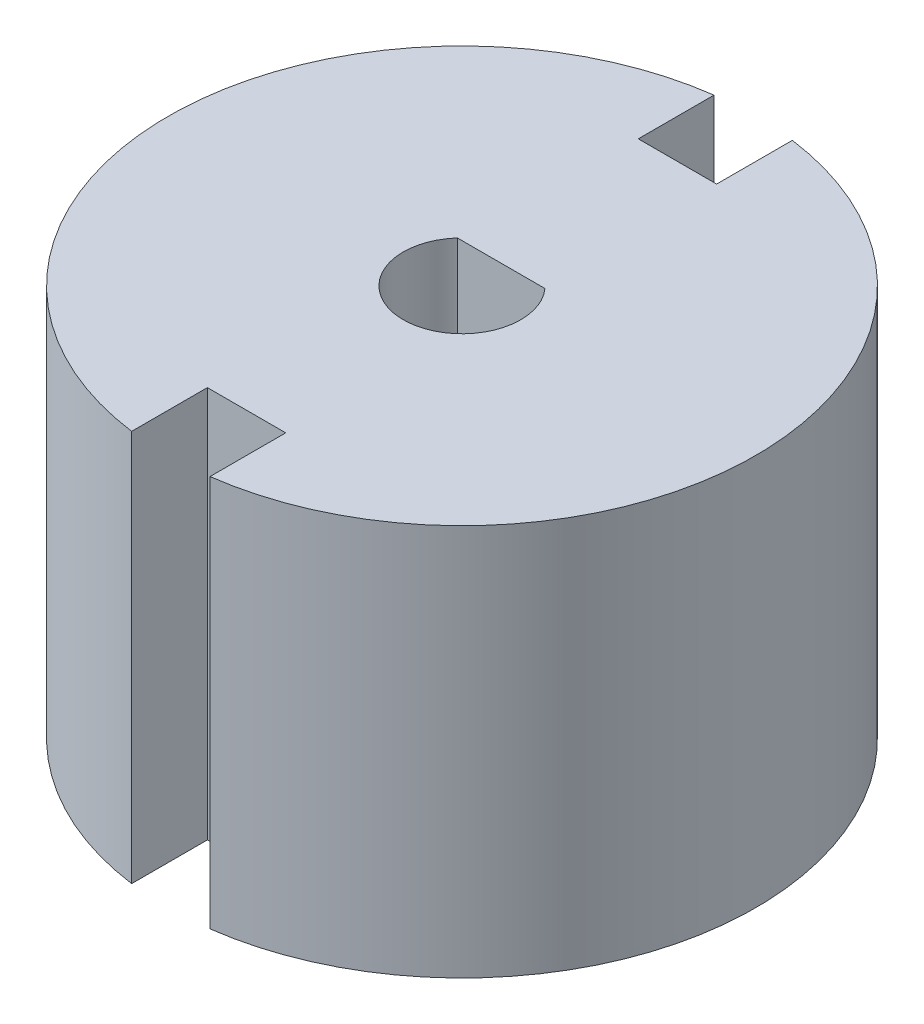
ISO-10303-21;
HEADER;
FILE_DESCRIPTION(('STEP AP214'),'2;1');
FILE_NAME('part.step','',(''),(''),'','','');
FILE_SCHEMA(('AUTOMOTIVE_DESIGN { 1 0 10303 214 1 1 1 1 }'));
ENDSEC;
DATA;
#1=APPLICATION_CONTEXT('core data for automotive mechanical design processes');
#2=APPLICATION_PROTOCOL_DEFINITION('international standard','automotive_design',2000,#1);
#3=PRODUCT_CONTEXT('',#1,'mechanical');
#4=PRODUCT('Part','Part','',(#3));
#5=PRODUCT_RELATED_PRODUCT_CATEGORY('part','',(#4));
#6=PRODUCT_DEFINITION_FORMATION('','',#4);
#7=PRODUCT_DEFINITION_CONTEXT('part definition',#1,'design');
#8=PRODUCT_DEFINITION('design','',#6,#7);
#9=PRODUCT_DEFINITION_SHAPE('','',#8);
#10=(LENGTH_UNIT() NAMED_UNIT(*) SI_UNIT(.MILLI.,.METRE.));
#11=(NAMED_UNIT(*) PLANE_ANGLE_UNIT() SI_UNIT($,.RADIAN.));
#12=(NAMED_UNIT(*) SI_UNIT($,.STERADIAN.) SOLID_ANGLE_UNIT());
#13=UNCERTAINTY_MEASURE_WITH_UNIT(LENGTH_MEASURE(1.E-05),#10,'distance_accuracy_value','');
#14=(GEOMETRIC_REPRESENTATION_CONTEXT(3) GLOBAL_UNCERTAINTY_ASSIGNED_CONTEXT((#13)) GLOBAL_UNIT_ASSIGNED_CONTEXT((#10,
#11,#12)) REPRESENTATION_CONTEXT('',''));
#15=CARTESIAN_POINT('',(0.,0.,0.));
#16=DIRECTION('',(0.,0.,1.));
#17=DIRECTION('',(1.,0.,0.));
#18=AXIS2_PLACEMENT_3D('',#15,#16,#17);
#19=CARTESIAN_POINT('',(1.,10.,0.));
#20=DIRECTION('',(1.,0.,0.));
#21=DIRECTION('',(0.,0.,-1.));
#22=AXIS2_PLACEMENT_3D('',#19,#20,#21);
#23=PLANE('',#22);
#24=DIRECTION('',(0.,0.,1.));
#25=VECTOR('',#24,1.);
#26=CARTESIAN_POINT('',(1.,0.,0.));
#27=LINE('',#26,#25);
#28=CARTESIAN_POINT('',(1.,0.,5.5));
#29=VERTEX_POINT('',#28);
#30=CARTESIAN_POINT('',(1.,0.,7.43303437365925));
#31=VERTEX_POINT('',#30);
#32=EDGE_CURVE('E154',#29,#31,#27,.T.);
#33=ORIENTED_EDGE('',*,*,#32,.T.);
#34=DIRECTION('',(0.,-1.,0.));
#35=VECTOR('',#34,1.);
#36=CARTESIAN_POINT('',(1.,10.,7.43303437365925));
#37=LINE('',#36,#35);
#38=CARTESIAN_POINT('',(1.,10.,7.43303437365925));
#39=VERTEX_POINT('',#38);
#40=EDGE_CURVE('E11',#39,#31,#37,.T.);
#41=ORIENTED_EDGE('',*,*,#40,.F.);
#42=DIRECTION('',(0.,0.,1.));
#43=VECTOR('',#42,1.);
#44=CARTESIAN_POINT('',(1.,10.,0.));
#45=LINE('',#44,#43);
#46=CARTESIAN_POINT('',(1.,10.,5.5));
#47=VERTEX_POINT('',#46);
#48=EDGE_CURVE('E229',#47,#39,#45,.T.);
#49=ORIENTED_EDGE('',*,*,#48,.F.);
#50=DIRECTION('',(0.,-1.,0.));
#51=VECTOR('',#50,1.);
#52=CARTESIAN_POINT('',(1.,10.,5.5));
#53=LINE('',#52,#51);
#54=EDGE_CURVE('E172',#47,#29,#53,.T.);
#55=ORIENTED_EDGE('',*,*,#54,.T.);
#56=EDGE_LOOP('',(#33,#41,#49,#55));
#57=FACE_BOUND('',#56,.T.);
#58=ADVANCED_FACE('F35',(#57),#23,.F.);
#59=CARTESIAN_POINT('',(0.,10.,0.));
#60=DIRECTION('',(0.,-1.,0.));
#61=DIRECTION('',(0.,0.,-1.));
#62=AXIS2_PLACEMENT_3D('',#59,#60,#61);
#63=CYLINDRICAL_SURFACE('',#62,7.5);
#64=CARTESIAN_POINT('',(0.,0.,0.));
#65=DIRECTION('',(0.,1.,0.));
#66=DIRECTION('',(0.,0.,1.));
#67=AXIS2_PLACEMENT_3D('',#64,#65,#66);
#68=CIRCLE('',#67,7.5);
#69=CARTESIAN_POINT('',(1.,0.,-7.43303437365925));
#70=VERTEX_POINT('',#69);
#71=EDGE_CURVE('E157',#31,#70,#68,.T.);
#72=ORIENTED_EDGE('',*,*,#71,.T.);
#73=DIRECTION('',(0.,-1.,0.));
#74=VECTOR('',#73,1.);
#75=CARTESIAN_POINT('',(1.,10.,-7.43303437365925));
#76=LINE('',#75,#74);
#77=CARTESIAN_POINT('',(1.,10.,-7.43303437365925));
#78=VERTEX_POINT('',#77);
#79=EDGE_CURVE('E45',#78,#70,#76,.T.);
#80=ORIENTED_EDGE('',*,*,#79,.F.);
#81=CARTESIAN_POINT('',(0.,10.,0.));
#82=DIRECTION('',(0.,1.,0.));
#83=DIRECTION('',(0.,0.,1.));
#84=AXIS2_PLACEMENT_3D('',#81,#82,#83);
#85=CIRCLE('',#84,7.5);
#86=EDGE_CURVE('E130',#39,#78,#85,.T.);
#87=ORIENTED_EDGE('',*,*,#86,.F.);
#88=ORIENTED_EDGE('',*,*,#40,.T.);
#89=EDGE_LOOP('',(#72,#80,#87,#88));
#90=FACE_BOUND('',#89,.T.);
#91=ADVANCED_FACE('F198',(#90),#63,.T.);
#92=CARTESIAN_POINT('',(1.,10.,0.));
#93=DIRECTION('',(1.,0.,0.));
#94=DIRECTION('',(0.,0.,-1.));
#95=AXIS2_PLACEMENT_3D('',#92,#93,#94);
#96=PLANE('',#95);
#97=DIRECTION('',(0.,0.,1.));
#98=VECTOR('',#97,1.);
#99=CARTESIAN_POINT('',(1.,0.,0.));
#100=LINE('',#99,#98);
#101=CARTESIAN_POINT('',(1.,0.,-5.5));
#102=VERTEX_POINT('',#101);
#103=EDGE_CURVE('E159',#70,#102,#100,.T.);
#104=ORIENTED_EDGE('',*,*,#103,.T.);
#105=DIRECTION('',(0.,-1.,0.));
#106=VECTOR('',#105,1.);
#107=CARTESIAN_POINT('',(1.,10.,-5.5));
#108=LINE('',#107,#106);
#109=CARTESIAN_POINT('',(1.,10.,-5.5));
#110=VERTEX_POINT('',#109);
#111=EDGE_CURVE('E178',#110,#102,#108,.T.);
#112=ORIENTED_EDGE('',*,*,#111,.F.);
#113=DIRECTION('',(0.,0.,1.));
#114=VECTOR('',#113,1.);
#115=CARTESIAN_POINT('',(1.,10.,0.));
#116=LINE('',#115,#114);
#117=EDGE_CURVE('E233',#78,#110,#116,.T.);
#118=ORIENTED_EDGE('',*,*,#117,.F.);
#119=ORIENTED_EDGE('',*,*,#79,.T.);
#120=EDGE_LOOP('',(#104,#112,#118,#119));
#121=FACE_BOUND('',#120,.T.);
#122=ADVANCED_FACE('F204',(#121),#96,.F.);
#123=CARTESIAN_POINT('',(0.,10.,-5.5));
#124=DIRECTION('',(0.,0.,-1.));
#125=DIRECTION('',(-1.,0.,0.));
#126=AXIS2_PLACEMENT_3D('',#123,#124,#125);
#127=PLANE('',#126);
#128=DIRECTION('',(1.,0.,0.));
#129=VECTOR('',#128,1.);
#130=CARTESIAN_POINT('',(0.,0.,-5.5));
#131=LINE('',#130,#129);
#132=CARTESIAN_POINT('',(-1.,0.,-5.5));
#133=VERTEX_POINT('',#132);
#134=EDGE_CURVE('E162',#133,#102,#131,.T.);
#135=ORIENTED_EDGE('',*,*,#134,.F.);
#136=DIRECTION('',(0.,-1.,0.));
#137=VECTOR('',#136,1.);
#138=CARTESIAN_POINT('',(-1.,10.,-5.5));
#139=LINE('',#138,#137);
#140=CARTESIAN_POINT('',(-1.,10.,-5.5));
#141=VERTEX_POINT('',#140);
#142=EDGE_CURVE('E176',#141,#133,#139,.T.);
#143=ORIENTED_EDGE('',*,*,#142,.F.);
#144=DIRECTION('',(1.,0.,0.));
#145=VECTOR('',#144,1.);
#146=CARTESIAN_POINT('',(0.,10.,-5.5));
#147=LINE('',#146,#145);
#148=EDGE_CURVE('E234',#141,#110,#147,.T.);
#149=ORIENTED_EDGE('',*,*,#148,.T.);
#150=ORIENTED_EDGE('',*,*,#111,.T.);
#151=EDGE_LOOP('',(#135,#143,#149,#150));
#152=FACE_BOUND('',#151,.T.);
#153=ADVANCED_FACE('F210',(#152),#127,.T.);
#154=CARTESIAN_POINT('',(-1.,10.,0.));
#155=DIRECTION('',(1.,0.,0.));
#156=DIRECTION('',(0.,0.,-1.));
#157=AXIS2_PLACEMENT_3D('',#154,#155,#156);
#158=PLANE('',#157);
#159=DIRECTION('',(0.,0.,1.));
#160=VECTOR('',#159,1.);
#161=CARTESIAN_POINT('',(-1.,0.,0.));
#162=LINE('',#161,#160);
#163=CARTESIAN_POINT('',(-1.,0.,-7.43303437365925));
#164=VERTEX_POINT('',#163);
#165=EDGE_CURVE('E165',#164,#133,#162,.T.);
#166=ORIENTED_EDGE('',*,*,#165,.F.);
#167=DIRECTION('',(0.,-1.,0.));
#168=VECTOR('',#167,1.);
#169=CARTESIAN_POINT('',(-1.,10.,-7.43303437365925));
#170=LINE('',#169,#168);
#171=CARTESIAN_POINT('',(-1.,10.,-7.43303437365925));
#172=VERTEX_POINT('',#171);
#173=EDGE_CURVE('E139',#172,#164,#170,.T.);
#174=ORIENTED_EDGE('',*,*,#173,.F.);
#175=DIRECTION('',(0.,0.,1.));
#176=VECTOR('',#175,1.);
#177=CARTESIAN_POINT('',(-1.,10.,0.));
#178=LINE('',#177,#176);
#179=EDGE_CURVE('E127',#172,#141,#178,.T.);
#180=ORIENTED_EDGE('',*,*,#179,.T.);
#181=ORIENTED_EDGE('',*,*,#142,.T.);
#182=EDGE_LOOP('',(#166,#174,#180,#181));
#183=FACE_BOUND('',#182,.T.);
#184=ADVANCED_FACE('F214',(#183),#158,.T.);
#185=CARTESIAN_POINT('',(-1.,0.,7.43303437365925));
#186=VERTEX_POINT('',#185);
#187=EDGE_CURVE('E135',#164,#186,#68,.T.);
#188=ORIENTED_EDGE('',*,*,#187,.T.);
#189=DIRECTION('',(0.,-1.,0.));
#190=VECTOR('',#189,1.);
#191=CARTESIAN_POINT('',(-1.,10.,7.43303437365925));
#192=LINE('',#191,#190);
#193=CARTESIAN_POINT('',(-1.,10.,7.43303437365925));
#194=VERTEX_POINT('',#193);
#195=EDGE_CURVE('E132',#194,#186,#192,.T.);
#196=ORIENTED_EDGE('',*,*,#195,.F.);
#197=EDGE_CURVE('E120',#172,#194,#85,.T.);
#198=ORIENTED_EDGE('',*,*,#197,.F.);
#199=ORIENTED_EDGE('',*,*,#173,.T.);
#200=EDGE_LOOP('',(#188,#196,#198,#199));
#201=FACE_BOUND('',#200,.T.);
#202=ADVANCED_FACE('F133',(#201),#63,.T.);
#203=CARTESIAN_POINT('',(-1.,10.,0.));
#204=DIRECTION('',(1.,0.,0.));
#205=DIRECTION('',(0.,0.,-1.));
#206=AXIS2_PLACEMENT_3D('',#203,#204,#205);
#207=PLANE('',#206);
#208=DIRECTION('',(0.,0.,1.));
#209=VECTOR('',#208,1.);
#210=CARTESIAN_POINT('',(-1.,0.,0.));
#211=LINE('',#210,#209);
#212=CARTESIAN_POINT('',(-1.,0.,5.5));
#213=VERTEX_POINT('',#212);
#214=EDGE_CURVE('E168',#213,#186,#211,.T.);
#215=ORIENTED_EDGE('',*,*,#214,.F.);
#216=DIRECTION('',(0.,-1.,0.));
#217=VECTOR('',#216,1.);
#218=CARTESIAN_POINT('',(-1.,10.,5.5));
#219=LINE('',#218,#217);
#220=CARTESIAN_POINT('',(-1.,10.,5.5));
#221=VERTEX_POINT('',#220);
#222=EDGE_CURVE('E88',#221,#213,#219,.T.);
#223=ORIENTED_EDGE('',*,*,#222,.F.);
#224=DIRECTION('',(0.,0.,1.));
#225=VECTOR('',#224,1.);
#226=CARTESIAN_POINT('',(-1.,10.,0.));
#227=LINE('',#226,#225);
#228=EDGE_CURVE('E124',#221,#194,#227,.T.);
#229=ORIENTED_EDGE('',*,*,#228,.T.);
#230=ORIENTED_EDGE('',*,*,#195,.T.);
#231=EDGE_LOOP('',(#215,#223,#229,#230));
#232=FACE_BOUND('',#231,.T.);
#233=ADVANCED_FACE('F141',(#232),#207,.T.);
#234=CARTESIAN_POINT('',(0.,10.,0.));
#235=DIRECTION('',(0.,-1.,0.));
#236=DIRECTION('',(0.,0.,-1.));
#237=AXIS2_PLACEMENT_3D('',#234,#235,#236);
#238=CYLINDRICAL_SURFACE('',#237,1.5);
#239=CARTESIAN_POINT('',(0.,0.,0.));
#240=DIRECTION('',(0.,1.,0.));
#241=DIRECTION('',(0.,0.,1.));
#242=AXIS2_PLACEMENT_3D('',#239,#240,#241);
#243=CIRCLE('',#242,1.5);
#244=CARTESIAN_POINT('',(-1.11803398874989,0.,-1.));
#245=VERTEX_POINT('',#244);
#246=CARTESIAN_POINT('',(1.11803398874989,0.,-1.));
#247=VERTEX_POINT('',#246);
#248=EDGE_CURVE('E148',#245,#247,#243,.T.);
#249=ORIENTED_EDGE('',*,*,#248,.F.);
#250=DIRECTION('',(0.,-1.,0.));
#251=VECTOR('',#250,1.);
#252=CARTESIAN_POINT('',(-1.11803398874989,10.,-1.));
#253=LINE('',#252,#251);
#254=CARTESIAN_POINT('',(-1.11803398874989,10.,-1.));
#255=VERTEX_POINT('',#254);
#256=EDGE_CURVE('E39',#255,#245,#253,.T.);
#257=ORIENTED_EDGE('',*,*,#256,.F.);
#258=CARTESIAN_POINT('',(0.,10.,0.));
#259=DIRECTION('',(0.,1.,0.));
#260=DIRECTION('',(0.,0.,1.));
#261=AXIS2_PLACEMENT_3D('',#258,#259,#260);
#262=CIRCLE('',#261,1.5);
#263=CARTESIAN_POINT('',(1.11803398874989,10.,-1.));
#264=VERTEX_POINT('',#263);
#265=EDGE_CURVE('E171',#255,#264,#262,.T.);
#266=ORIENTED_EDGE('',*,*,#265,.T.);
#267=DIRECTION('',(0.,-1.,0.));
#268=VECTOR('',#267,1.);
#269=CARTESIAN_POINT('',(1.11803398874989,10.,-1.));
#270=LINE('',#269,#268);
#271=EDGE_CURVE('E143',#264,#247,#270,.T.);
#272=ORIENTED_EDGE('',*,*,#271,.T.);
#273=EDGE_LOOP('',(#249,#257,#266,#272));
#274=FACE_BOUND('',#273,.T.);
#275=ADVANCED_FACE('F37',(#274),#238,.F.);
#276=CARTESIAN_POINT('',(0.,10.,-1.));
#277=DIRECTION('',(0.,0.,-1.));
#278=DIRECTION('',(-1.,0.,0.));
#279=AXIS2_PLACEMENT_3D('',#276,#277,#278);
#280=PLANE('',#279);
#281=DIRECTION('',(1.,0.,0.));
#282=VECTOR('',#281,1.);
#283=CARTESIAN_POINT('',(0.,0.,-1.));
#284=LINE('',#283,#282);
#285=EDGE_CURVE('E151',#245,#247,#284,.T.);
#286=ORIENTED_EDGE('',*,*,#285,.T.);
#287=ORIENTED_EDGE('',*,*,#271,.F.);
#288=DIRECTION('',(1.,0.,0.));
#289=VECTOR('',#288,1.);
#290=CARTESIAN_POINT('',(0.,10.,-1.));
#291=LINE('',#290,#289);
#292=EDGE_CURVE('E185',#255,#264,#291,.T.);
#293=ORIENTED_EDGE('',*,*,#292,.F.);
#294=ORIENTED_EDGE('',*,*,#256,.T.);
#295=EDGE_LOOP('',(#286,#287,#293,#294));
#296=FACE_BOUND('',#295,.T.);
#297=ADVANCED_FACE('F184',(#296),#280,.F.);
#298=CARTESIAN_POINT('',(0.,10.,5.5));
#299=DIRECTION('',(0.,0.,-1.));
#300=DIRECTION('',(-1.,0.,0.));
#301=AXIS2_PLACEMENT_3D('',#298,#299,#300);
#302=PLANE('',#301);
#303=DIRECTION('',(1.,0.,0.));
#304=VECTOR('',#303,1.);
#305=CARTESIAN_POINT('',(0.,0.,5.5));
#306=LINE('',#305,#304);
#307=EDGE_CURVE('E91',#213,#29,#306,.T.);
#308=ORIENTED_EDGE('',*,*,#307,.T.);
#309=ORIENTED_EDGE('',*,*,#54,.F.);
#310=DIRECTION('',(1.,0.,0.));
#311=VECTOR('',#310,1.);
#312=CARTESIAN_POINT('',(0.,10.,5.5));
#313=LINE('',#312,#311);
#314=EDGE_CURVE('E54',#221,#47,#313,.T.);
#315=ORIENTED_EDGE('',*,*,#314,.F.);
#316=ORIENTED_EDGE('',*,*,#222,.T.);
#317=EDGE_LOOP('',(#308,#309,#315,#316));
#318=FACE_BOUND('',#317,.T.);
#319=ADVANCED_FACE('F195',(#318),#302,.F.);
#320=CARTESIAN_POINT('',(0.,10.,0.));
#321=DIRECTION('',(0.,1.,0.));
#322=DIRECTION('',(0.,0.,1.));
#323=AXIS2_PLACEMENT_3D('',#320,#321,#322);
#324=PLANE('',#323);
#325=ORIENTED_EDGE('',*,*,#265,.F.);
#326=ORIENTED_EDGE('',*,*,#292,.T.);
#327=EDGE_LOOP('',(#325,#326));
#328=FACE_BOUND('',#327,.T.);
#329=ORIENTED_EDGE('',*,*,#48,.T.);
#330=ORIENTED_EDGE('',*,*,#86,.T.);
#331=ORIENTED_EDGE('',*,*,#117,.T.);
#332=ORIENTED_EDGE('',*,*,#148,.F.);
#333=ORIENTED_EDGE('',*,*,#179,.F.);
#334=ORIENTED_EDGE('',*,*,#197,.T.);
#335=ORIENTED_EDGE('',*,*,#228,.F.);
#336=ORIENTED_EDGE('',*,*,#314,.T.);
#337=EDGE_LOOP('',(#329,#330,#331,#332,#333,#334,#335,#336));
#338=FACE_BOUND('',#337,.T.);
#339=ADVANCED_FACE('F122',(#328,#338),#324,.T.);
#340=CARTESIAN_POINT('',(0.,0.,0.));
#341=DIRECTION('',(0.,1.,0.));
#342=DIRECTION('',(0.,0.,1.));
#343=AXIS2_PLACEMENT_3D('',#340,#341,#342);
#344=PLANE('',#343);
#345=ORIENTED_EDGE('',*,*,#248,.T.);
#346=ORIENTED_EDGE('',*,*,#285,.F.);
#347=EDGE_LOOP('',(#345,#346));
#348=FACE_BOUND('',#347,.T.);
#349=ORIENTED_EDGE('',*,*,#32,.F.);
#350=ORIENTED_EDGE('',*,*,#307,.F.);
#351=ORIENTED_EDGE('',*,*,#214,.T.);
#352=ORIENTED_EDGE('',*,*,#187,.F.);
#353=ORIENTED_EDGE('',*,*,#165,.T.);
#354=ORIENTED_EDGE('',*,*,#134,.T.);
#355=ORIENTED_EDGE('',*,*,#103,.F.);
#356=ORIENTED_EDGE('',*,*,#71,.F.);
#357=EDGE_LOOP('',(#349,#350,#351,#352,#353,#354,#355,#356));
#358=FACE_BOUND('',#357,.T.);
#359=ADVANCED_FACE('F188',(#348,#358),#344,.F.);
#360=CLOSED_SHELL('',(#58,#91,#122,#153,#184,#202,#233,#275,#297,#319,#339,#359));
#361=MANIFOLD_SOLID_BREP('B2',#360);
#362=ADVANCED_BREP_SHAPE_REPRESENTATION('',(#18,#361),#14);
#363=SHAPE_DEFINITION_REPRESENTATION(#9,#362);
ENDSEC;
END-ISO-10303-21;
